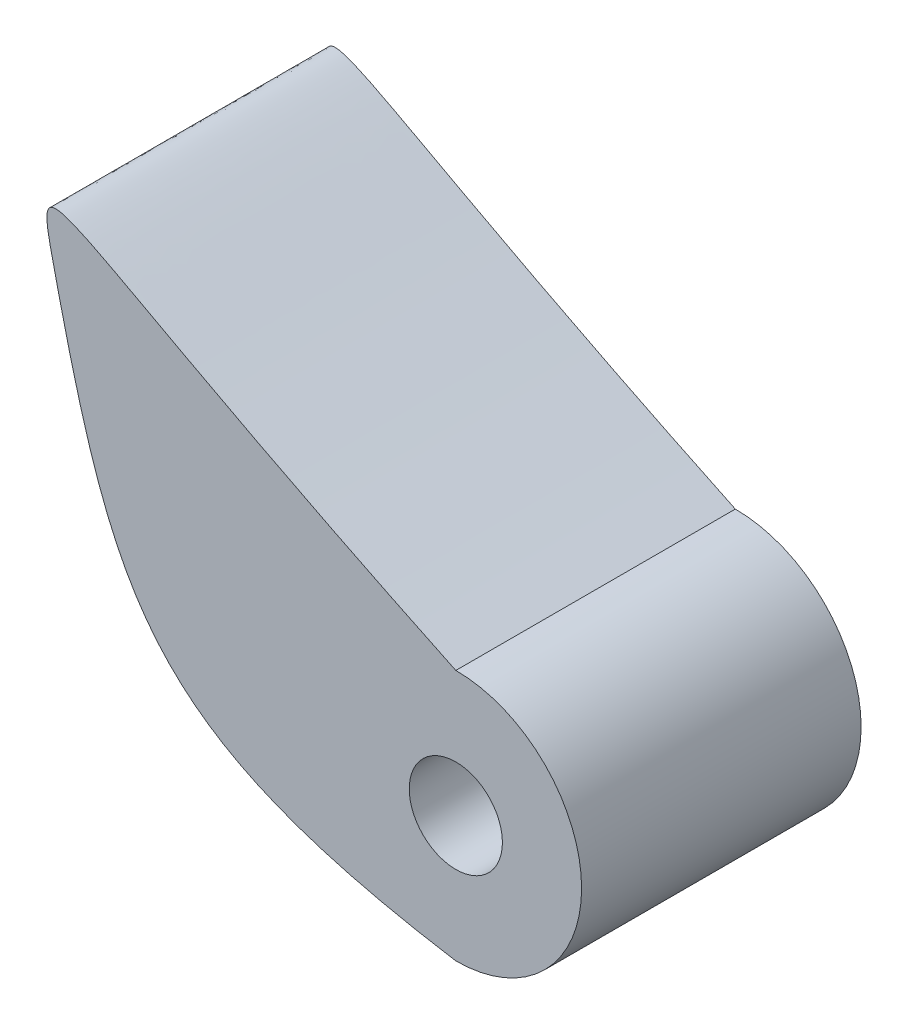
ISO-10303-21;
HEADER;
FILE_DESCRIPTION(('STEP AP214'),'2;1');
FILE_NAME('part.step','',(''),(''),'','','');
FILE_SCHEMA(('AUTOMOTIVE_DESIGN { 1 0 10303 214 1 1 1 1 }'));
ENDSEC;
DATA;
#1=APPLICATION_CONTEXT('core data for automotive mechanical design processes');
#2=APPLICATION_PROTOCOL_DEFINITION('international standard','automotive_design',2000,#1);
#3=PRODUCT_CONTEXT('',#1,'mechanical');
#4=PRODUCT('Part','Part','',(#3));
#5=PRODUCT_RELATED_PRODUCT_CATEGORY('part','',(#4));
#6=PRODUCT_DEFINITION_FORMATION('','',#4);
#7=PRODUCT_DEFINITION_CONTEXT('part definition',#1,'design');
#8=PRODUCT_DEFINITION('design','',#6,#7);
#9=PRODUCT_DEFINITION_SHAPE('','',#8);
#10=(LENGTH_UNIT() NAMED_UNIT(*) SI_UNIT(.MILLI.,.METRE.));
#11=(NAMED_UNIT(*) PLANE_ANGLE_UNIT() SI_UNIT($,.RADIAN.));
#12=(NAMED_UNIT(*) SI_UNIT($,.STERADIAN.) SOLID_ANGLE_UNIT());
#13=UNCERTAINTY_MEASURE_WITH_UNIT(LENGTH_MEASURE(1.E-05),#10,'distance_accuracy_value','');
#14=(GEOMETRIC_REPRESENTATION_CONTEXT(3) GLOBAL_UNCERTAINTY_ASSIGNED_CONTEXT((#13)) GLOBAL_UNIT_ASSIGNED_CONTEXT((#10,
#11,#12)) REPRESENTATION_CONTEXT('',''));
#15=CARTESIAN_POINT('',(0.,0.,0.));
#16=DIRECTION('',(0.,0.,1.));
#17=DIRECTION('',(1.,0.,0.));
#18=AXIS2_PLACEMENT_3D('',#15,#16,#17);
#19=CARTESIAN_POINT('',(0.,-6.75,-15.));
#20=CARTESIAN_POINT('',(-12.8410874560347,-4.66484879323894,-15.));
#21=CARTESIAN_POINT('',(-18.2183744386455,0.101610435845555,-15.));
#22=CARTESIAN_POINT('',(-23.1139041146912,21.4668311955079,-15.));
#23=CARTESIAN_POINT('',(-22.1620828051884,17.286541146133,-15.));
#24=CARTESIAN_POINT('',(0.,6.75,-15.));
#25=B_SPLINE_CURVE_WITH_KNOTS('',3,(#19,#20,#21,#22,#23,#24),.UNSPECIFIED.,.F.,.F.,(4,1,1,4),
(0.,0.428893749792263,0.581534400068823,1.),.UNSPECIFIED.);
#26=DIRECTION('',(0.,0.,1.));
#27=VECTOR('',#26,1.);
#28=SURFACE_OF_LINEAR_EXTRUSION('',#25,#27);
#29=CARTESIAN_POINT('',(0.,-6.75,0.));
#30=CARTESIAN_POINT('',(-12.8410874560347,-4.66484879323894,0.));
#31=CARTESIAN_POINT('',(-18.2183744386455,0.101610435845555,0.));
#32=CARTESIAN_POINT('',(-23.1139041146912,21.4668311955079,0.));
#33=CARTESIAN_POINT('',(-22.1620828051884,17.286541146133,0.));
#34=CARTESIAN_POINT('',(0.,6.75,0.));
#35=B_SPLINE_CURVE_WITH_KNOTS('',3,(#29,#30,#31,#32,#33,#34),.UNSPECIFIED.,.F.,.F.,(4,1,1,4),
(0.,0.428893749792263,0.581534400068823,1.),.UNSPECIFIED.);
#36=CARTESIAN_POINT('',(0.,-6.75,0.));
#37=VERTEX_POINT('',#36);
#38=CARTESIAN_POINT('',(0.,6.75,0.));
#39=VERTEX_POINT('',#38);
#40=EDGE_CURVE('E72',#37,#39,#35,.T.);
#41=ORIENTED_EDGE('',*,*,#40,.T.);
#42=DIRECTION('',(0.,0.,1.));
#43=VECTOR('',#42,1.);
#44=CARTESIAN_POINT('',(0.,6.75,-15.));
#45=LINE('',#44,#43);
#46=CARTESIAN_POINT('',(0.,6.75,-15.));
#47=VERTEX_POINT('',#46);
#48=EDGE_CURVE('E11',#47,#39,#45,.T.);
#49=ORIENTED_EDGE('',*,*,#48,.F.);
#50=CARTESIAN_POINT('',(0.,-6.75,-15.));
#51=VERTEX_POINT('',#50);
#52=EDGE_CURVE('E56',#51,#47,#25,.T.);
#53=ORIENTED_EDGE('',*,*,#52,.F.);
#54=DIRECTION('',(0.,0.,1.));
#55=VECTOR('',#54,1.);
#56=CARTESIAN_POINT('',(0.,-6.75,-15.));
#57=LINE('',#56,#55);
#58=EDGE_CURVE('E44',#51,#37,#57,.T.);
#59=ORIENTED_EDGE('',*,*,#58,.T.);
#60=EDGE_LOOP('',(#41,#49,#53,#59));
#61=FACE_BOUND('',#60,.T.);
#62=ADVANCED_FACE('F40',(#61),#28,.F.);
#63=CARTESIAN_POINT('',(0.,0.,-15.));
#64=DIRECTION('',(0.,0.,1.));
#65=DIRECTION('',(1.,0.,0.));
#66=AXIS2_PLACEMENT_3D('',#63,#64,#65);
#67=CYLINDRICAL_SURFACE('',#66,6.75);
#68=CARTESIAN_POINT('',(0.,0.,0.));
#69=DIRECTION('',(0.,0.,1.));
#70=DIRECTION('',(1.,0.,0.));
#71=AXIS2_PLACEMENT_3D('',#68,#69,#70);
#72=CIRCLE('',#71,6.75);
#73=EDGE_CURVE('E70',#37,#39,#72,.T.);
#74=ORIENTED_EDGE('',*,*,#73,.F.);
#75=ORIENTED_EDGE('',*,*,#58,.F.);
#76=CARTESIAN_POINT('',(0.,0.,-15.));
#77=DIRECTION('',(0.,0.,1.));
#78=DIRECTION('',(1.,0.,0.));
#79=AXIS2_PLACEMENT_3D('',#76,#77,#78);
#80=CIRCLE('',#79,6.75);
#81=EDGE_CURVE('E71',#51,#47,#80,.T.);
#82=ORIENTED_EDGE('',*,*,#81,.T.);
#83=ORIENTED_EDGE('',*,*,#48,.T.);
#84=EDGE_LOOP('',(#74,#75,#82,#83));
#85=FACE_BOUND('',#84,.T.);
#86=ADVANCED_FACE('F68',(#85),#67,.T.);
#87=CARTESIAN_POINT('',(0.,0.,-15.));
#88=DIRECTION('',(0.,0.,1.));
#89=DIRECTION('',(1.,0.,0.));
#90=AXIS2_PLACEMENT_3D('',#87,#88,#89);
#91=CYLINDRICAL_SURFACE('',#90,2.5);
#92=CARTESIAN_POINT('',(0.,0.,-15.));
#93=DIRECTION('',(0.,0.,1.));
#94=DIRECTION('',(1.,0.,0.));
#95=AXIS2_PLACEMENT_3D('',#92,#93,#94);
#96=CIRCLE('',#95,2.5);
#97=CARTESIAN_POINT('',(2.5,0.,-15.));
#98=VERTEX_POINT('',#97);
#99=EDGE_CURVE('E84',#98,#98,#96,.T.);
#100=ORIENTED_EDGE('',*,*,#99,.F.);
#101=EDGE_LOOP('',(#100));
#102=FACE_BOUND('',#101,.T.);
#103=CARTESIAN_POINT('',(0.,0.,0.));
#104=DIRECTION('',(0.,0.,1.));
#105=DIRECTION('',(1.,0.,0.));
#106=AXIS2_PLACEMENT_3D('',#103,#104,#105);
#107=CIRCLE('',#106,2.5);
#108=CARTESIAN_POINT('',(2.5,0.,0.));
#109=VERTEX_POINT('',#108);
#110=EDGE_CURVE('E77',#109,#109,#107,.T.);
#111=ORIENTED_EDGE('',*,*,#110,.T.);
#112=EDGE_LOOP('',(#111));
#113=FACE_BOUND('',#112,.T.);
#114=ADVANCED_FACE('F100',(#102,#113),#91,.F.);
#115=CARTESIAN_POINT('',(0.,0.,-15.));
#116=DIRECTION('',(0.,0.,1.));
#117=DIRECTION('',(1.,0.,0.));
#118=AXIS2_PLACEMENT_3D('',#115,#116,#117);
#119=PLANE('',#118);
#120=ORIENTED_EDGE('',*,*,#52,.T.);
#121=ORIENTED_EDGE('',*,*,#81,.F.);
#122=EDGE_LOOP('',(#120,#121));
#123=FACE_BOUND('',#122,.T.);
#124=ORIENTED_EDGE('',*,*,#99,.T.);
#125=EDGE_LOOP('',(#124));
#126=FACE_BOUND('',#125,.T.);
#127=ADVANCED_FACE('F98',(#123,#126),#119,.F.);
#128=CARTESIAN_POINT('',(0.,0.,0.));
#129=DIRECTION('',(0.,0.,1.));
#130=DIRECTION('',(1.,0.,0.));
#131=AXIS2_PLACEMENT_3D('',#128,#129,#130);
#132=PLANE('',#131);
#133=ORIENTED_EDGE('',*,*,#40,.F.);
#134=ORIENTED_EDGE('',*,*,#73,.T.);
#135=EDGE_LOOP('',(#133,#134));
#136=FACE_BOUND('',#135,.T.);
#137=ORIENTED_EDGE('',*,*,#110,.F.);
#138=EDGE_LOOP('',(#137));
#139=FACE_BOUND('',#138,.T.);
#140=ADVANCED_FACE('F75',(#136,#139),#132,.T.);
#141=CLOSED_SHELL('',(#62,#86,#114,#127,#140));
#142=MANIFOLD_SOLID_BREP('B2',#141);
#143=ADVANCED_BREP_SHAPE_REPRESENTATION('',(#18,#142),#14);
#144=SHAPE_DEFINITION_REPRESENTATION(#9,#143);
ENDSEC;
END-ISO-10303-21;
